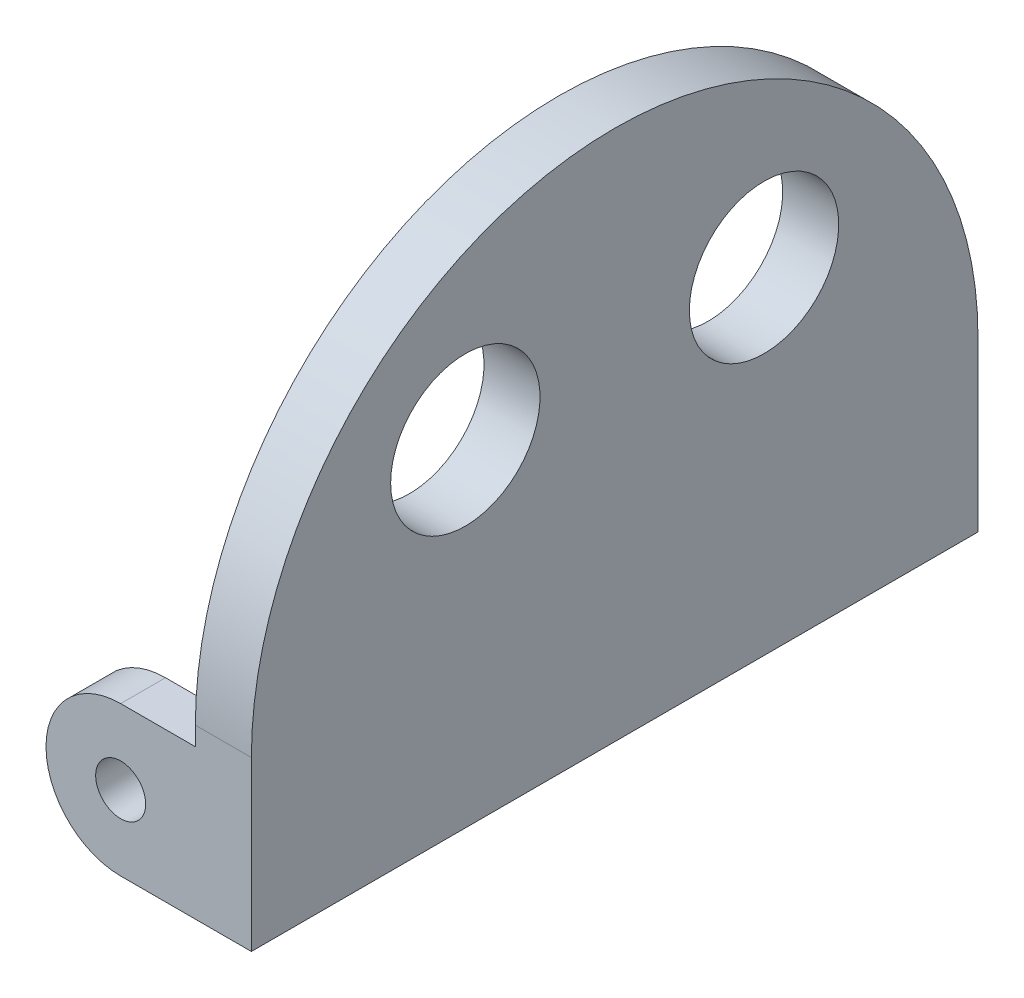
ISO-10303-21;
HEADER;
FILE_DESCRIPTION(('STEP AP214'),'2;1');
FILE_NAME('part.step','',(''),(''),'','','');
FILE_SCHEMA(('AUTOMOTIVE_DESIGN { 1 0 10303 214 1 1 1 1 }'));
ENDSEC;
DATA;
#1=APPLICATION_CONTEXT('core data for automotive mechanical design processes');
#2=APPLICATION_PROTOCOL_DEFINITION('international standard','automotive_design',2000,#1);
#3=PRODUCT_CONTEXT('',#1,'mechanical');
#4=PRODUCT('Part','Part','',(#3));
#5=PRODUCT_RELATED_PRODUCT_CATEGORY('part','',(#4));
#6=PRODUCT_DEFINITION_FORMATION('','',#4);
#7=PRODUCT_DEFINITION_CONTEXT('part definition',#1,'design');
#8=PRODUCT_DEFINITION('design','',#6,#7);
#9=PRODUCT_DEFINITION_SHAPE('','',#8);
#10=(LENGTH_UNIT() NAMED_UNIT(*) SI_UNIT(.MILLI.,.METRE.));
#11=(NAMED_UNIT(*) PLANE_ANGLE_UNIT() SI_UNIT($,.RADIAN.));
#12=(NAMED_UNIT(*) SI_UNIT($,.STERADIAN.) SOLID_ANGLE_UNIT());
#13=UNCERTAINTY_MEASURE_WITH_UNIT(LENGTH_MEASURE(1.E-05),#10,'distance_accuracy_value','');
#14=(GEOMETRIC_REPRESENTATION_CONTEXT(3) GLOBAL_UNCERTAINTY_ASSIGNED_CONTEXT((#13)) GLOBAL_UNIT_ASSIGNED_CONTEXT((#10,
#11,#12)) REPRESENTATION_CONTEXT('',''));
#15=CARTESIAN_POINT('',(0.,0.,0.));
#16=DIRECTION('',(0.,0.,1.));
#17=DIRECTION('',(1.,0.,0.));
#18=AXIS2_PLACEMENT_3D('',#15,#16,#17);
#19=CARTESIAN_POINT('',(-25.75,15.05,42.135));
#20=DIRECTION('',(1.,0.,0.));
#21=DIRECTION('',(0.,0.,-1.));
#22=AXIS2_PLACEMENT_3D('',#19,#20,#21);
#23=CYLINDRICAL_SURFACE('',#22,4.86500000000001);
#24=CARTESIAN_POINT('',(-25.,15.05,42.135));
#25=DIRECTION('',(-1.,0.,0.));
#26=DIRECTION('',(0.,0.,1.));
#27=AXIS2_PLACEMENT_3D('',#24,#25,#26);
#28=CIRCLE('',#27,4.86500000000001);
#29=CARTESIAN_POINT('',(-25.,15.05,47.));
#30=VERTEX_POINT('',#29);
#31=CARTESIAN_POINT('',(-25.,15.05,37.27));
#32=VERTEX_POINT('',#31);
#33=EDGE_CURVE('E162',#30,#32,#28,.T.);
#34=ORIENTED_EDGE('',*,*,#33,.T.);
#35=DIRECTION('',(1.,0.,0.));
#36=VECTOR('',#35,1.);
#37=CARTESIAN_POINT('',(-25.75,15.05,37.27));
#38=LINE('',#37,#36);
#39=CARTESIAN_POINT('',(-25.75,15.05,37.27));
#40=VERTEX_POINT('',#39);
#41=EDGE_CURVE('E198',#40,#32,#38,.T.);
#42=ORIENTED_EDGE('',*,*,#41,.F.);
#43=CARTESIAN_POINT('',(-25.75,15.05,42.135));
#44=DIRECTION('',(-1.,0.,0.));
#45=DIRECTION('',(0.,0.,1.));
#46=AXIS2_PLACEMENT_3D('',#43,#44,#45);
#47=CIRCLE('',#46,4.86500000000001);
#48=CARTESIAN_POINT('',(-25.75,15.05,47.));
#49=VERTEX_POINT('',#48);
#50=EDGE_CURVE('E172',#49,#40,#47,.T.);
#51=ORIENTED_EDGE('',*,*,#50,.F.);
#52=DIRECTION('',(1.,0.,0.));
#53=VECTOR('',#52,1.);
#54=CARTESIAN_POINT('',(-25.75,15.05,47.));
#55=LINE('',#54,#53);
#56=EDGE_CURVE('E182',#49,#30,#55,.T.);
#57=ORIENTED_EDGE('',*,*,#56,.T.);
#58=EDGE_LOOP('',(#34,#42,#51,#57));
#59=FACE_BOUND('',#58,.T.);
#60=ADVANCED_FACE('F39',(#59),#23,.T.);
#61=CARTESIAN_POINT('',(-25.75,12.8,37.27));
#62=DIRECTION('',(0.,0.,1.));
#63=DIRECTION('',(1.,0.,0.));
#64=AXIS2_PLACEMENT_3D('',#61,#62,#63);
#65=PLANE('',#64);
#66=CARTESIAN_POINT('',(-26.75,13.8,37.27));
#67=DIRECTION('',(0.,0.,1.));
#68=DIRECTION('',(1.,0.,0.));
#69=AXIS2_PLACEMENT_3D('',#66,#67,#68);
#70=CIRCLE('',#69,0.334999999999999);
#71=CARTESIAN_POINT('',(-26.415,13.8,37.27));
#72=VERTEX_POINT('',#71);
#73=EDGE_CURVE('E229',#72,#72,#70,.T.);
#74=ORIENTED_EDGE('',*,*,#73,.T.);
#75=EDGE_LOOP('',(#74));
#76=FACE_BOUND('',#75,.T.);
#77=CARTESIAN_POINT('',(-26.75,13.8,37.27));
#78=DIRECTION('',(0.,0.,1.));
#79=DIRECTION('',(1.,0.,0.));
#80=AXIS2_PLACEMENT_3D('',#77,#78,#79);
#81=CIRCLE('',#80,1.);
#82=CARTESIAN_POINT('',(-26.75,12.8,37.27));
#83=VERTEX_POINT('',#82);
#84=CARTESIAN_POINT('',(-27.75,13.8,37.27));
#85=VERTEX_POINT('',#84);
#86=EDGE_CURVE('E201',#83,#85,#81,.F.);
#87=ORIENTED_EDGE('',*,*,#86,.T.);
#88=CARTESIAN_POINT('',(-26.75,13.8,37.27));
#89=DIRECTION('',(0.,0.,1.));
#90=DIRECTION('',(1.,0.,0.));
#91=AXIS2_PLACEMENT_3D('',#88,#89,#90);
#92=CIRCLE('',#91,1.);
#93=CARTESIAN_POINT('',(-26.75,14.8,37.27));
#94=VERTEX_POINT('',#93);
#95=EDGE_CURVE('E203',#85,#94,#92,.F.);
#96=ORIENTED_EDGE('',*,*,#95,.T.);
#97=DIRECTION('',(1.,0.,0.));
#98=VECTOR('',#97,1.);
#99=CARTESIAN_POINT('',(-27.75,14.8,37.27));
#100=LINE('',#99,#98);
#101=CARTESIAN_POINT('',(-25.75,14.8,37.27));
#102=VERTEX_POINT('',#101);
#103=EDGE_CURVE('E168',#94,#102,#100,.T.);
#104=ORIENTED_EDGE('',*,*,#103,.T.);
#105=DIRECTION('',(0.,-1.,0.));
#106=VECTOR('',#105,1.);
#107=CARTESIAN_POINT('',(-25.75,12.8,37.27));
#108=LINE('',#107,#106);
#109=EDGE_CURVE('E175',#40,#102,#108,.T.);
#110=ORIENTED_EDGE('',*,*,#109,.F.);
#111=ORIENTED_EDGE('',*,*,#41,.T.);
#112=DIRECTION('',(0.,-1.,0.));
#113=VECTOR('',#112,1.);
#114=CARTESIAN_POINT('',(-25.,12.8,37.27));
#115=LINE('',#114,#113);
#116=CARTESIAN_POINT('',(-25.,12.8,37.27));
#117=VERTEX_POINT('',#116);
#118=EDGE_CURVE('E185',#32,#117,#115,.T.);
#119=ORIENTED_EDGE('',*,*,#118,.T.);
#120=DIRECTION('',(1.,0.,0.));
#121=VECTOR('',#120,1.);
#122=CARTESIAN_POINT('',(-25.75,12.8,37.27));
#123=LINE('',#122,#121);
#124=EDGE_CURVE('E196',#83,#117,#123,.T.);
#125=ORIENTED_EDGE('',*,*,#124,.F.);
#126=EDGE_LOOP('',(#87,#96,#104,#110,#111,#119,#125));
#127=FACE_BOUND('',#126,.T.);
#128=ADVANCED_FACE('F281',(#76,#127),#65,.F.);
#129=CARTESIAN_POINT('',(-25.75,12.8,47.));
#130=DIRECTION('',(0.,1.,0.));
#131=DIRECTION('',(0.,0.,1.));
#132=AXIS2_PLACEMENT_3D('',#129,#130,#131);
#133=PLANE('',#132);
#134=DIRECTION('',(1.,0.,0.));
#135=VECTOR('',#134,1.);
#136=CARTESIAN_POINT('',(-27.75,12.8,37.87));
#137=LINE('',#136,#135);
#138=CARTESIAN_POINT('',(-26.75,12.8,37.87));
#139=VERTEX_POINT('',#138);
#140=CARTESIAN_POINT('',(-25.75,12.8,37.87));
#141=VERTEX_POINT('',#140);
#142=EDGE_CURVE('E163',#139,#141,#137,.T.);
#143=ORIENTED_EDGE('',*,*,#142,.F.);
#144=DIRECTION('',(0.,0.,1.));
#145=VECTOR('',#144,1.);
#146=CARTESIAN_POINT('',(-26.75,12.8,37.27));
#147=LINE('',#146,#145);
#148=EDGE_CURVE('E214',#139,#83,#147,.F.);
#149=ORIENTED_EDGE('',*,*,#148,.T.);
#150=ORIENTED_EDGE('',*,*,#124,.T.);
#151=DIRECTION('',(0.,0.,1.));
#152=VECTOR('',#151,1.);
#153=CARTESIAN_POINT('',(-25.,12.8,47.));
#154=LINE('',#153,#152);
#155=CARTESIAN_POINT('',(-25.,12.8,47.));
#156=VERTEX_POINT('',#155);
#157=EDGE_CURVE('E188',#117,#156,#154,.T.);
#158=ORIENTED_EDGE('',*,*,#157,.T.);
#159=DIRECTION('',(1.,0.,0.));
#160=VECTOR('',#159,1.);
#161=CARTESIAN_POINT('',(-25.75,12.8,47.));
#162=LINE('',#161,#160);
#163=CARTESIAN_POINT('',(-26.75,12.8,47.));
#164=VERTEX_POINT('',#163);
#165=EDGE_CURVE('E194',#164,#156,#162,.T.);
#166=ORIENTED_EDGE('',*,*,#165,.F.);
#167=DIRECTION('',(0.,0.,1.));
#168=VECTOR('',#167,1.);
#169=CARTESIAN_POINT('',(-26.75,12.8,47.));
#170=LINE('',#169,#168);
#171=CARTESIAN_POINT('',(-26.75,12.8,46.4));
#172=VERTEX_POINT('',#171);
#173=EDGE_CURVE('E212',#164,#172,#170,.F.);
#174=ORIENTED_EDGE('',*,*,#173,.T.);
#175=DIRECTION('',(1.,0.,0.));
#176=VECTOR('',#175,1.);
#177=CARTESIAN_POINT('',(-27.75,12.8,46.4));
#178=LINE('',#177,#176);
#179=CARTESIAN_POINT('',(-25.75,12.8,46.4));
#180=VERTEX_POINT('',#179);
#181=EDGE_CURVE('E138',#172,#180,#178,.T.);
#182=ORIENTED_EDGE('',*,*,#181,.T.);
#183=DIRECTION('',(0.,0.,1.));
#184=VECTOR('',#183,1.);
#185=CARTESIAN_POINT('',(-25.75,12.8,47.));
#186=LINE('',#185,#184);
#187=EDGE_CURVE('E148',#141,#180,#186,.T.);
#188=ORIENTED_EDGE('',*,*,#187,.F.);
#189=EDGE_LOOP('',(#143,#149,#150,#158,#166,#174,#182,#188));
#190=FACE_BOUND('',#189,.T.);
#191=ADVANCED_FACE('F289',(#190),#133,.F.);
#192=CARTESIAN_POINT('',(-25.75,15.05,47.));
#193=DIRECTION('',(0.,0.,-1.));
#194=DIRECTION('',(-1.,0.,0.));
#195=AXIS2_PLACEMENT_3D('',#192,#193,#194);
#196=PLANE('',#195);
#197=CARTESIAN_POINT('',(-26.75,13.8,47.));
#198=DIRECTION('',(0.,0.,1.));
#199=DIRECTION('',(1.,0.,0.));
#200=AXIS2_PLACEMENT_3D('',#197,#198,#199);
#201=CIRCLE('',#200,0.334999999999999);
#202=CARTESIAN_POINT('',(-26.415,13.8,47.));
#203=VERTEX_POINT('',#202);
#204=EDGE_CURVE('E233',#203,#203,#201,.T.);
#205=ORIENTED_EDGE('',*,*,#204,.F.);
#206=EDGE_LOOP('',(#205));
#207=FACE_BOUND('',#206,.T.);
#208=DIRECTION('',(1.,0.,0.));
#209=VECTOR('',#208,1.);
#210=CARTESIAN_POINT('',(-27.75,14.8,47.));
#211=LINE('',#210,#209);
#212=CARTESIAN_POINT('',(-26.75,14.8,47.));
#213=VERTEX_POINT('',#212);
#214=CARTESIAN_POINT('',(-25.75,14.8,47.));
#215=VERTEX_POINT('',#214);
#216=EDGE_CURVE('E137',#213,#215,#211,.T.);
#217=ORIENTED_EDGE('',*,*,#216,.F.);
#218=CARTESIAN_POINT('',(-26.75,13.8,47.));
#219=DIRECTION('',(0.,0.,-1.));
#220=DIRECTION('',(-1.,0.,0.));
#221=AXIS2_PLACEMENT_3D('',#218,#219,#220);
#222=CIRCLE('',#221,1.);
#223=CARTESIAN_POINT('',(-27.75,13.8,47.));
#224=VERTEX_POINT('',#223);
#225=EDGE_CURVE('E11',#213,#224,#222,.F.);
#226=ORIENTED_EDGE('',*,*,#225,.T.);
#227=CARTESIAN_POINT('',(-26.75,13.8,47.));
#228=DIRECTION('',(0.,0.,-1.));
#229=DIRECTION('',(-1.,0.,0.));
#230=AXIS2_PLACEMENT_3D('',#227,#228,#229);
#231=CIRCLE('',#230,1.);
#232=EDGE_CURVE('E48',#224,#164,#231,.F.);
#233=ORIENTED_EDGE('',*,*,#232,.T.);
#234=ORIENTED_EDGE('',*,*,#165,.T.);
#235=DIRECTION('',(0.,1.,0.));
#236=VECTOR('',#235,1.);
#237=CARTESIAN_POINT('',(-25.,15.05,47.));
#238=LINE('',#237,#236);
#239=EDGE_CURVE('E176',#156,#30,#238,.T.);
#240=ORIENTED_EDGE('',*,*,#239,.T.);
#241=ORIENTED_EDGE('',*,*,#56,.F.);
#242=DIRECTION('',(0.,1.,0.));
#243=VECTOR('',#242,1.);
#244=CARTESIAN_POINT('',(-25.75,15.05,47.));
#245=LINE('',#244,#243);
#246=EDGE_CURVE('E180',#215,#49,#245,.T.);
#247=ORIENTED_EDGE('',*,*,#246,.F.);
#248=EDGE_LOOP('',(#217,#226,#233,#234,#240,#241,#247));
#249=FACE_BOUND('',#248,.T.);
#250=ADVANCED_FACE('F264',(#207,#249),#196,.F.);
#251=CARTESIAN_POINT('',(-25.75,15.05,42.135));
#252=DIRECTION('',(-1.,0.,0.));
#253=DIRECTION('',(0.,0.,1.));
#254=AXIS2_PLACEMENT_3D('',#251,#252,#253);
#255=PLANE('',#254);
#256=CARTESIAN_POINT('',(-25.75,17.3,40.135));
#257=DIRECTION('',(-1.,0.,0.));
#258=DIRECTION('',(0.,0.,1.));
#259=AXIS2_PLACEMENT_3D('',#256,#257,#258);
#260=CIRCLE('',#259,1.);
#261=CARTESIAN_POINT('',(-25.75,17.3,41.135));
#262=VERTEX_POINT('',#261);
#263=EDGE_CURVE('E246',#262,#262,#260,.T.);
#264=ORIENTED_EDGE('',*,*,#263,.F.);
#265=EDGE_LOOP('',(#264));
#266=FACE_BOUND('',#265,.T.);
#267=CARTESIAN_POINT('',(-25.75,17.3,44.135));
#268=DIRECTION('',(-1.,0.,0.));
#269=DIRECTION('',(0.,0.,1.));
#270=AXIS2_PLACEMENT_3D('',#267,#268,#269);
#271=CIRCLE('',#270,1.);
#272=CARTESIAN_POINT('',(-25.75,17.3,45.135));
#273=VERTEX_POINT('',#272);
#274=EDGE_CURVE('E243',#273,#273,#271,.T.);
#275=ORIENTED_EDGE('',*,*,#274,.F.);
#276=EDGE_LOOP('',(#275));
#277=FACE_BOUND('',#276,.T.);
#278=DIRECTION('',(0.,-1.,0.));
#279=VECTOR('',#278,1.);
#280=CARTESIAN_POINT('',(-25.75,12.8,46.4));
#281=LINE('',#280,#279);
#282=CARTESIAN_POINT('',(-25.75,14.8,46.4));
#283=VERTEX_POINT('',#282);
#284=EDGE_CURVE('E132',#283,#180,#281,.T.);
#285=ORIENTED_EDGE('',*,*,#284,.F.);
#286=DIRECTION('',(0.,0.,-1.));
#287=VECTOR('',#286,1.);
#288=CARTESIAN_POINT('',(-25.75,14.8,47.));
#289=LINE('',#288,#287);
#290=EDGE_CURVE('E144',#215,#283,#289,.T.);
#291=ORIENTED_EDGE('',*,*,#290,.F.);
#292=ORIENTED_EDGE('',*,*,#246,.T.);
#293=ORIENTED_EDGE('',*,*,#50,.T.);
#294=ORIENTED_EDGE('',*,*,#109,.T.);
#295=DIRECTION('',(0.,0.,-1.));
#296=VECTOR('',#295,1.);
#297=CARTESIAN_POINT('',(-25.75,14.8,37.27));
#298=LINE('',#297,#296);
#299=CARTESIAN_POINT('',(-25.75,14.8,37.87));
#300=VERTEX_POINT('',#299);
#301=EDGE_CURVE('E154',#300,#102,#298,.T.);
#302=ORIENTED_EDGE('',*,*,#301,.F.);
#303=DIRECTION('',(0.,1.,0.));
#304=VECTOR('',#303,1.);
#305=CARTESIAN_POINT('',(-25.75,12.8,37.87));
#306=LINE('',#305,#304);
#307=EDGE_CURVE('E151',#141,#300,#306,.T.);
#308=ORIENTED_EDGE('',*,*,#307,.F.);
#309=ORIENTED_EDGE('',*,*,#187,.T.);
#310=EDGE_LOOP('',(#285,#291,#292,#293,#294,#302,#308,#309));
#311=FACE_BOUND('',#310,.T.);
#312=ADVANCED_FACE('F143',(#266,#277,#311),#255,.T.);
#313=CARTESIAN_POINT('',(-25.,15.05,42.135));
#314=DIRECTION('',(-1.,0.,0.));
#315=DIRECTION('',(0.,0.,1.));
#316=AXIS2_PLACEMENT_3D('',#313,#314,#315);
#317=PLANE('',#316);
#318=CARTESIAN_POINT('',(-25.,17.3,40.135));
#319=DIRECTION('',(-1.,0.,0.));
#320=DIRECTION('',(0.,0.,1.));
#321=AXIS2_PLACEMENT_3D('',#318,#319,#320);
#322=CIRCLE('',#321,1.);
#323=CARTESIAN_POINT('',(-25.,17.3,41.135));
#324=VERTEX_POINT('',#323);
#325=EDGE_CURVE('E238',#324,#324,#322,.T.);
#326=ORIENTED_EDGE('',*,*,#325,.T.);
#327=EDGE_LOOP('',(#326));
#328=FACE_BOUND('',#327,.T.);
#329=CARTESIAN_POINT('',(-25.,17.3,44.135));
#330=DIRECTION('',(-1.,0.,0.));
#331=DIRECTION('',(0.,0.,1.));
#332=AXIS2_PLACEMENT_3D('',#329,#330,#331);
#333=CIRCLE('',#332,1.);
#334=CARTESIAN_POINT('',(-25.,17.3,45.135));
#335=VERTEX_POINT('',#334);
#336=EDGE_CURVE('E240',#335,#335,#333,.T.);
#337=ORIENTED_EDGE('',*,*,#336,.T.);
#338=EDGE_LOOP('',(#337));
#339=FACE_BOUND('',#338,.T.);
#340=ORIENTED_EDGE('',*,*,#33,.F.);
#341=ORIENTED_EDGE('',*,*,#239,.F.);
#342=ORIENTED_EDGE('',*,*,#157,.F.);
#343=ORIENTED_EDGE('',*,*,#118,.F.);
#344=EDGE_LOOP('',(#340,#341,#342,#343));
#345=FACE_BOUND('',#344,.T.);
#346=ADVANCED_FACE('F252',(#328,#339,#345),#317,.F.);
#347=CARTESIAN_POINT('',(-27.75,12.8,37.87));
#348=DIRECTION('',(0.,0.,-1.));
#349=DIRECTION('',(-1.,0.,0.));
#350=AXIS2_PLACEMENT_3D('',#347,#348,#349);
#351=PLANE('',#350);
#352=CARTESIAN_POINT('',(-26.75,13.8,37.87));
#353=DIRECTION('',(0.,0.,-1.));
#354=DIRECTION('',(-1.,0.,0.));
#355=AXIS2_PLACEMENT_3D('',#352,#353,#354);
#356=CIRCLE('',#355,0.334999999999999);
#357=CARTESIAN_POINT('',(-27.085,13.8,37.87));
#358=VERTEX_POINT('',#357);
#359=EDGE_CURVE('E157',#358,#358,#356,.T.);
#360=ORIENTED_EDGE('',*,*,#359,.T.);
#361=EDGE_LOOP('',(#360));
#362=FACE_BOUND('',#361,.T.);
#363=DIRECTION('',(1.,0.,0.));
#364=VECTOR('',#363,1.);
#365=CARTESIAN_POINT('',(-27.75,14.8,37.87));
#366=LINE('',#365,#364);
#367=CARTESIAN_POINT('',(-26.75,14.8,37.87));
#368=VERTEX_POINT('',#367);
#369=EDGE_CURVE('E165',#368,#300,#366,.T.);
#370=ORIENTED_EDGE('',*,*,#369,.F.);
#371=CARTESIAN_POINT('',(-26.75,13.8,37.87));
#372=DIRECTION('',(0.,0.,-1.));
#373=DIRECTION('',(-1.,0.,0.));
#374=AXIS2_PLACEMENT_3D('',#371,#372,#373);
#375=CIRCLE('',#374,1.);
#376=CARTESIAN_POINT('',(-27.75,13.8,37.87));
#377=VERTEX_POINT('',#376);
#378=EDGE_CURVE('E210',#368,#377,#375,.F.);
#379=ORIENTED_EDGE('',*,*,#378,.T.);
#380=CARTESIAN_POINT('',(-26.75,13.8,37.87));
#381=DIRECTION('',(0.,0.,-1.));
#382=DIRECTION('',(-1.,0.,0.));
#383=AXIS2_PLACEMENT_3D('',#380,#381,#382);
#384=CIRCLE('',#383,1.);
#385=EDGE_CURVE('E208',#377,#139,#384,.F.);
#386=ORIENTED_EDGE('',*,*,#385,.T.);
#387=ORIENTED_EDGE('',*,*,#142,.T.);
#388=ORIENTED_EDGE('',*,*,#307,.T.);
#389=EDGE_LOOP('',(#370,#379,#386,#387,#388));
#390=FACE_BOUND('',#389,.T.);
#391=ADVANCED_FACE('F334',(#362,#390),#351,.F.);
#392=CARTESIAN_POINT('',(-27.75,14.8,37.27));
#393=DIRECTION('',(0.,-1.,0.));
#394=DIRECTION('',(0.,0.,-1.));
#395=AXIS2_PLACEMENT_3D('',#392,#393,#394);
#396=PLANE('',#395);
#397=ORIENTED_EDGE('',*,*,#103,.F.);
#398=DIRECTION('',(0.,0.,-1.));
#399=VECTOR('',#398,1.);
#400=CARTESIAN_POINT('',(-26.75,14.8,37.87));
#401=LINE('',#400,#399);
#402=EDGE_CURVE('E205',#94,#368,#401,.F.);
#403=ORIENTED_EDGE('',*,*,#402,.T.);
#404=ORIENTED_EDGE('',*,*,#369,.T.);
#405=ORIENTED_EDGE('',*,*,#301,.T.);
#406=EDGE_LOOP('',(#397,#403,#404,#405));
#407=FACE_BOUND('',#406,.T.);
#408=ADVANCED_FACE('F329',(#407),#396,.F.);
#409=CARTESIAN_POINT('',(-27.75,14.8,47.));
#410=DIRECTION('',(0.,-1.,0.));
#411=DIRECTION('',(0.,0.,-1.));
#412=AXIS2_PLACEMENT_3D('',#409,#410,#411);
#413=PLANE('',#412);
#414=DIRECTION('',(1.,0.,0.));
#415=VECTOR('',#414,1.);
#416=CARTESIAN_POINT('',(-27.75,14.8,46.4));
#417=LINE('',#416,#415);
#418=CARTESIAN_POINT('',(-26.75,14.8,46.4));
#419=VERTEX_POINT('',#418);
#420=EDGE_CURVE('E128',#419,#283,#417,.T.);
#421=ORIENTED_EDGE('',*,*,#420,.F.);
#422=DIRECTION('',(0.,0.,-1.));
#423=VECTOR('',#422,1.);
#424=CARTESIAN_POINT('',(-26.75,14.8,47.));
#425=LINE('',#424,#423);
#426=EDGE_CURVE('E219',#419,#213,#425,.F.);
#427=ORIENTED_EDGE('',*,*,#426,.T.);
#428=ORIENTED_EDGE('',*,*,#216,.T.);
#429=ORIENTED_EDGE('',*,*,#290,.T.);
#430=EDGE_LOOP('',(#421,#427,#428,#429));
#431=FACE_BOUND('',#430,.T.);
#432=ADVANCED_FACE('F150',(#431),#413,.F.);
#433=CARTESIAN_POINT('',(-27.75,12.8,46.4));
#434=DIRECTION('',(0.,0.,1.));
#435=DIRECTION('',(1.,0.,0.));
#436=AXIS2_PLACEMENT_3D('',#433,#434,#435);
#437=PLANE('',#436);
#438=CARTESIAN_POINT('',(-26.75,13.8,46.4));
#439=DIRECTION('',(0.,0.,1.));
#440=DIRECTION('',(1.,0.,0.));
#441=AXIS2_PLACEMENT_3D('',#438,#439,#440);
#442=CIRCLE('',#441,0.334999999999999);
#443=CARTESIAN_POINT('',(-26.415,13.8,46.4));
#444=VERTEX_POINT('',#443);
#445=EDGE_CURVE('E43',#444,#444,#442,.T.);
#446=ORIENTED_EDGE('',*,*,#445,.T.);
#447=EDGE_LOOP('',(#446));
#448=FACE_BOUND('',#447,.T.);
#449=CARTESIAN_POINT('',(-26.75,13.8,46.4));
#450=DIRECTION('',(0.,0.,1.));
#451=DIRECTION('',(1.,0.,0.));
#452=AXIS2_PLACEMENT_3D('',#449,#450,#451);
#453=CIRCLE('',#452,1.);
#454=CARTESIAN_POINT('',(-27.75,13.8,46.4));
#455=VERTEX_POINT('',#454);
#456=EDGE_CURVE('E216',#172,#455,#453,.F.);
#457=ORIENTED_EDGE('',*,*,#456,.T.);
#458=CARTESIAN_POINT('',(-26.75,13.8,46.4));
#459=DIRECTION('',(0.,0.,1.));
#460=DIRECTION('',(1.,0.,0.));
#461=AXIS2_PLACEMENT_3D('',#458,#459,#460);
#462=CIRCLE('',#461,1.);
#463=EDGE_CURVE('E134',#455,#419,#462,.F.);
#464=ORIENTED_EDGE('',*,*,#463,.T.);
#465=ORIENTED_EDGE('',*,*,#420,.T.);
#466=ORIENTED_EDGE('',*,*,#284,.T.);
#467=ORIENTED_EDGE('',*,*,#181,.F.);
#468=EDGE_LOOP('',(#457,#464,#465,#466,#467));
#469=FACE_BOUND('',#468,.T.);
#470=ADVANCED_FACE('F130',(#448,#469),#437,.F.);
#471=CARTESIAN_POINT('',(-26.75,13.8,0.));
#472=DIRECTION('',(0.,0.,-1.));
#473=DIRECTION('',(0.,1.,0.));
#474=AXIS2_PLACEMENT_3D('',#471,#472,#473);
#475=CYLINDRICAL_SURFACE('',#474,1.);
#476=ORIENTED_EDGE('',*,*,#148,.F.);
#477=ORIENTED_EDGE('',*,*,#385,.F.);
#478=DIRECTION('',(0.,0.,1.));
#479=VECTOR('',#478,1.);
#480=CARTESIAN_POINT('',(-27.75,13.8,37.87));
#481=LINE('',#480,#479);
#482=EDGE_CURVE('E166',#85,#377,#481,.T.);
#483=ORIENTED_EDGE('',*,*,#482,.F.);
#484=ORIENTED_EDGE('',*,*,#86,.F.);
#485=EDGE_LOOP('',(#476,#477,#483,#484));
#486=FACE_BOUND('',#485,.T.);
#487=ADVANCED_FACE('F296',(#486),#475,.T.);
#488=CARTESIAN_POINT('',(-26.75,13.8000000000002,0.));
#489=DIRECTION('',(0.,0.,1.));
#490=DIRECTION('',(0.,-1.,0.));
#491=AXIS2_PLACEMENT_3D('',#488,#489,#490);
#492=CYLINDRICAL_SURFACE('',#491,1.);
#493=ORIENTED_EDGE('',*,*,#378,.F.);
#494=ORIENTED_EDGE('',*,*,#402,.F.);
#495=ORIENTED_EDGE('',*,*,#95,.F.);
#496=ORIENTED_EDGE('',*,*,#482,.T.);
#497=EDGE_LOOP('',(#493,#494,#495,#496));
#498=FACE_BOUND('',#497,.T.);
#499=ADVANCED_FACE('F293',(#498),#492,.T.);
#500=CARTESIAN_POINT('',(-26.75,13.8,0.));
#501=DIRECTION('',(0.,0.,1.));
#502=DIRECTION('',(0.,-1.,0.));
#503=AXIS2_PLACEMENT_3D('',#500,#501,#502);
#504=CYLINDRICAL_SURFACE('',#503,1.);
#505=ORIENTED_EDGE('',*,*,#173,.F.);
#506=ORIENTED_EDGE('',*,*,#232,.F.);
#507=DIRECTION('',(0.,0.,1.));
#508=VECTOR('',#507,1.);
#509=CARTESIAN_POINT('',(-27.75,13.8,0.));
#510=LINE('',#509,#508);
#511=EDGE_CURVE('E223',#455,#224,#510,.T.);
#512=ORIENTED_EDGE('',*,*,#511,.F.);
#513=ORIENTED_EDGE('',*,*,#456,.F.);
#514=EDGE_LOOP('',(#505,#506,#512,#513));
#515=FACE_BOUND('',#514,.T.);
#516=ADVANCED_FACE('F41',(#515),#504,.T.);
#517=CARTESIAN_POINT('',(-26.75,13.8,0.));
#518=DIRECTION('',(0.,0.,-1.));
#519=DIRECTION('',(-1.,0.,0.));
#520=AXIS2_PLACEMENT_3D('',#517,#518,#519);
#521=CYLINDRICAL_SURFACE('',#520,1.);
#522=ORIENTED_EDGE('',*,*,#225,.F.);
#523=ORIENTED_EDGE('',*,*,#426,.F.);
#524=ORIENTED_EDGE('',*,*,#463,.F.);
#525=ORIENTED_EDGE('',*,*,#511,.T.);
#526=EDGE_LOOP('',(#522,#523,#524,#525));
#527=FACE_BOUND('',#526,.T.);
#528=ADVANCED_FACE('F300',(#527),#521,.T.);
#529=CARTESIAN_POINT('',(-26.75,13.8,37.27));
#530=DIRECTION('',(0.,0.,1.));
#531=DIRECTION('',(1.,0.,0.));
#532=AXIS2_PLACEMENT_3D('',#529,#530,#531);
#533=CYLINDRICAL_SURFACE('',#532,0.334999999999999);
#534=ORIENTED_EDGE('',*,*,#204,.T.);
#535=EDGE_LOOP('',(#534));
#536=FACE_BOUND('',#535,.T.);
#537=ORIENTED_EDGE('',*,*,#445,.F.);
#538=EDGE_LOOP('',(#537));
#539=FACE_BOUND('',#538,.T.);
#540=ADVANCED_FACE('F276',(#536,#539),#533,.F.);
#541=ORIENTED_EDGE('',*,*,#73,.F.);
#542=EDGE_LOOP('',(#541));
#543=FACE_BOUND('',#542,.T.);
#544=ORIENTED_EDGE('',*,*,#359,.F.);
#545=EDGE_LOOP('',(#544));
#546=FACE_BOUND('',#545,.T.);
#547=ADVANCED_FACE('F269',(#543,#546),#533,.F.);
#548=CARTESIAN_POINT('',(-25.,17.3,44.135));
#549=DIRECTION('',(-1.,0.,0.));
#550=DIRECTION('',(0.,0.,1.));
#551=AXIS2_PLACEMENT_3D('',#548,#549,#550);
#552=CYLINDRICAL_SURFACE('',#551,1.);
#553=ORIENTED_EDGE('',*,*,#336,.F.);
#554=EDGE_LOOP('',(#553));
#555=FACE_BOUND('',#554,.T.);
#556=ORIENTED_EDGE('',*,*,#274,.T.);
#557=EDGE_LOOP('',(#556));
#558=FACE_BOUND('',#557,.T.);
#559=ADVANCED_FACE('F258',(#555,#558),#552,.F.);
#560=CARTESIAN_POINT('',(-25.,17.3,40.135));
#561=DIRECTION('',(-1.,0.,0.));
#562=DIRECTION('',(0.,0.,1.));
#563=AXIS2_PLACEMENT_3D('',#560,#561,#562);
#564=CYLINDRICAL_SURFACE('',#563,1.);
#565=ORIENTED_EDGE('',*,*,#325,.F.);
#566=EDGE_LOOP('',(#565));
#567=FACE_BOUND('',#566,.T.);
#568=ORIENTED_EDGE('',*,*,#263,.T.);
#569=EDGE_LOOP('',(#568));
#570=FACE_BOUND('',#569,.T.);
#571=ADVANCED_FACE('F255',(#567,#570),#564,.F.);
#572=CLOSED_SHELL('',(#60,#128,#191,#250,#312,#346,#391,#408,#432,#470,#487,#499,#516,#528,#540,
#547,#559,#571));
#573=MANIFOLD_SOLID_BREP('B2',#572);
#574=ADVANCED_BREP_SHAPE_REPRESENTATION('',(#18,#573),#14);
#575=SHAPE_DEFINITION_REPRESENTATION(#9,#574);
ENDSEC;
END-ISO-10303-21;
